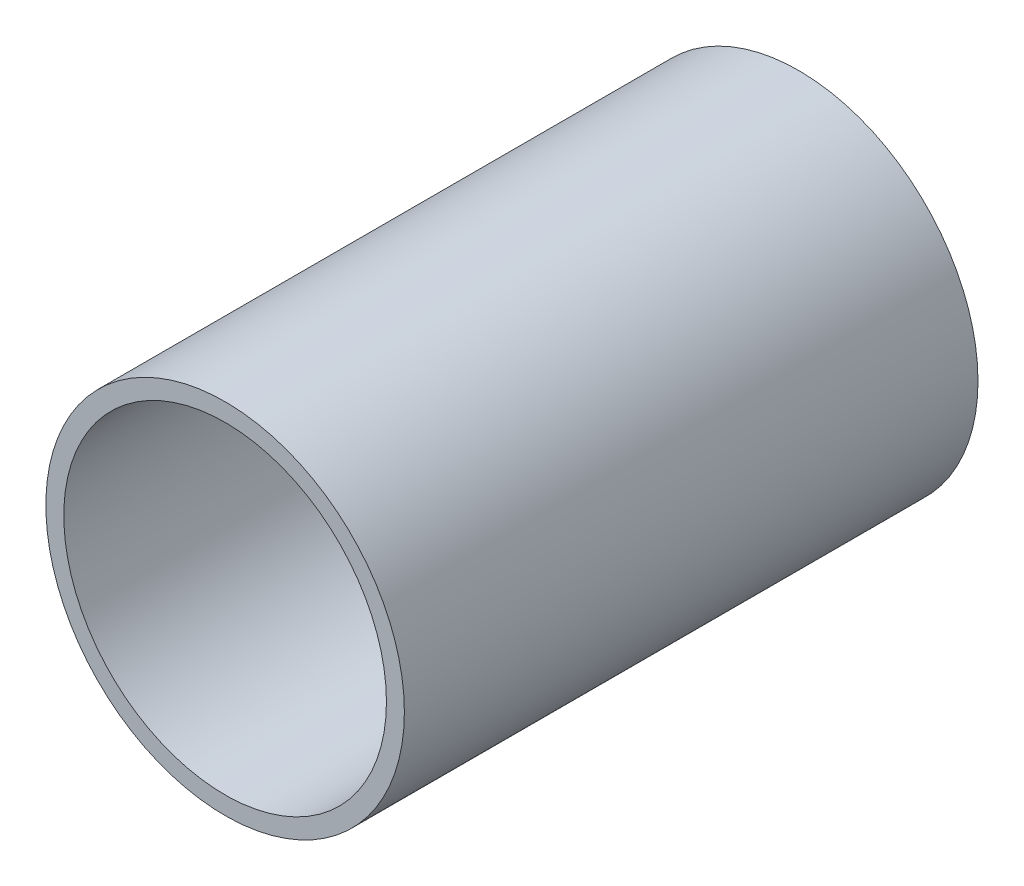
ISO-10303-21;
HEADER;
FILE_DESCRIPTION(('STEP AP214'),'2;1');
FILE_NAME('part.step','',(''),(''),'','','');
FILE_SCHEMA(('AUTOMOTIVE_DESIGN { 1 0 10303 214 1 1 1 1 }'));
ENDSEC;
DATA;
#1=APPLICATION_CONTEXT('core data for automotive mechanical design processes');
#2=APPLICATION_PROTOCOL_DEFINITION('international standard','automotive_design',2000,#1);
#3=PRODUCT_CONTEXT('',#1,'mechanical');
#4=PRODUCT('Part','Part','',(#3));
#5=PRODUCT_RELATED_PRODUCT_CATEGORY('part','',(#4));
#6=PRODUCT_DEFINITION_FORMATION('','',#4);
#7=PRODUCT_DEFINITION_CONTEXT('part definition',#1,'design');
#8=PRODUCT_DEFINITION('design','',#6,#7);
#9=PRODUCT_DEFINITION_SHAPE('','',#8);
#10=(LENGTH_UNIT() NAMED_UNIT(*) SI_UNIT(.MILLI.,.METRE.));
#11=(NAMED_UNIT(*) PLANE_ANGLE_UNIT() SI_UNIT($,.RADIAN.));
#12=(NAMED_UNIT(*) SI_UNIT($,.STERADIAN.) SOLID_ANGLE_UNIT());
#13=UNCERTAINTY_MEASURE_WITH_UNIT(LENGTH_MEASURE(1.E-05),#10,'distance_accuracy_value','');
#14=(GEOMETRIC_REPRESENTATION_CONTEXT(3) GLOBAL_UNCERTAINTY_ASSIGNED_CONTEXT((#13)) GLOBAL_UNIT_ASSIGNED_CONTEXT((#10,
#11,#12)) REPRESENTATION_CONTEXT('',''));
#15=CARTESIAN_POINT('',(0.,0.,0.));
#16=DIRECTION('',(0.,0.,1.));
#17=DIRECTION('',(1.,0.,0.));
#18=AXIS2_PLACEMENT_3D('',#15,#16,#17);
#19=CARTESIAN_POINT('',(0.,0.,80.));
#20=DIRECTION('',(0.,0.,1.));
#21=DIRECTION('',(1.,0.,0.));
#22=AXIS2_PLACEMENT_3D('',#19,#20,#21);
#23=PLANE('',#22);
#24=CARTESIAN_POINT('',(0.,0.,80.));
#25=DIRECTION('',(0.,0.,1.));
#26=DIRECTION('',(1.,0.,0.));
#27=AXIS2_PLACEMENT_3D('',#24,#25,#26);
#28=CIRCLE('',#27,50.);
#29=CARTESIAN_POINT('',(50.,0.,80.));
#30=VERTEX_POINT('',#29);
#31=EDGE_CURVE('E10',#30,#30,#28,.T.);
#32=ORIENTED_EDGE('',*,*,#31,.T.);
#33=EDGE_LOOP('',(#32));
#34=FACE_BOUND('',#33,.T.);
#35=CARTESIAN_POINT('',(0.,0.,80.));
#36=DIRECTION('',(0.,0.,1.));
#37=DIRECTION('',(1.,0.,0.));
#38=AXIS2_PLACEMENT_3D('',#35,#36,#37);
#39=CIRCLE('',#38,45.);
#40=CARTESIAN_POINT('',(45.,0.,80.));
#41=VERTEX_POINT('',#40);
#42=EDGE_CURVE('E44',#41,#41,#39,.T.);
#43=ORIENTED_EDGE('',*,*,#42,.F.);
#44=EDGE_LOOP('',(#43));
#45=FACE_BOUND('',#44,.T.);
#46=ADVANCED_FACE('F33',(#34,#45),#23,.T.);
#47=CARTESIAN_POINT('',(0.,0.,-80.));
#48=DIRECTION('',(0.,0.,1.));
#49=DIRECTION('',(1.,0.,0.));
#50=AXIS2_PLACEMENT_3D('',#47,#48,#49);
#51=PLANE('',#50);
#52=CARTESIAN_POINT('',(0.,0.,-80.));
#53=DIRECTION('',(0.,0.,1.));
#54=DIRECTION('',(1.,0.,0.));
#55=AXIS2_PLACEMENT_3D('',#52,#53,#54);
#56=CIRCLE('',#55,50.);
#57=CARTESIAN_POINT('',(50.,0.,-80.));
#58=VERTEX_POINT('',#57);
#59=EDGE_CURVE('E37',#58,#58,#56,.T.);
#60=ORIENTED_EDGE('',*,*,#59,.F.);
#61=EDGE_LOOP('',(#60));
#62=FACE_BOUND('',#61,.T.);
#63=CARTESIAN_POINT('',(0.,0.,-80.));
#64=DIRECTION('',(0.,0.,1.));
#65=DIRECTION('',(1.,0.,0.));
#66=AXIS2_PLACEMENT_3D('',#63,#64,#65);
#67=CIRCLE('',#66,45.);
#68=CARTESIAN_POINT('',(45.,0.,-80.));
#69=VERTEX_POINT('',#68);
#70=EDGE_CURVE('E46',#69,#69,#67,.T.);
#71=ORIENTED_EDGE('',*,*,#70,.T.);
#72=EDGE_LOOP('',(#71));
#73=FACE_BOUND('',#72,.T.);
#74=ADVANCED_FACE('F56',(#62,#73),#51,.F.);
#75=CARTESIAN_POINT('',(0.,0.,80.));
#76=DIRECTION('',(0.,0.,-1.));
#77=DIRECTION('',(-1.,0.,0.));
#78=AXIS2_PLACEMENT_3D('',#75,#76,#77);
#79=CYLINDRICAL_SURFACE('',#78,50.);
#80=ORIENTED_EDGE('',*,*,#31,.F.);
#81=EDGE_LOOP('',(#80));
#82=FACE_BOUND('',#81,.T.);
#83=ORIENTED_EDGE('',*,*,#59,.T.);
#84=EDGE_LOOP('',(#83));
#85=FACE_BOUND('',#84,.T.);
#86=ADVANCED_FACE('F35',(#82,#85),#79,.T.);
#87=CARTESIAN_POINT('',(0.,0.,80.));
#88=DIRECTION('',(0.,0.,-1.));
#89=DIRECTION('',(-1.,0.,0.));
#90=AXIS2_PLACEMENT_3D('',#87,#88,#89);
#91=CYLINDRICAL_SURFACE('',#90,45.);
#92=ORIENTED_EDGE('',*,*,#42,.T.);
#93=EDGE_LOOP('',(#92));
#94=FACE_BOUND('',#93,.T.);
#95=ORIENTED_EDGE('',*,*,#70,.F.);
#96=EDGE_LOOP('',(#95));
#97=FACE_BOUND('',#96,.T.);
#98=ADVANCED_FACE('F52',(#94,#97),#91,.F.);
#99=CLOSED_SHELL('',(#46,#74,#86,#98));
#100=MANIFOLD_SOLID_BREP('B2',#99);
#101=ADVANCED_BREP_SHAPE_REPRESENTATION('',(#18,#100),#14);
#102=SHAPE_DEFINITION_REPRESENTATION(#9,#101);
ENDSEC;
END-ISO-10303-21;
